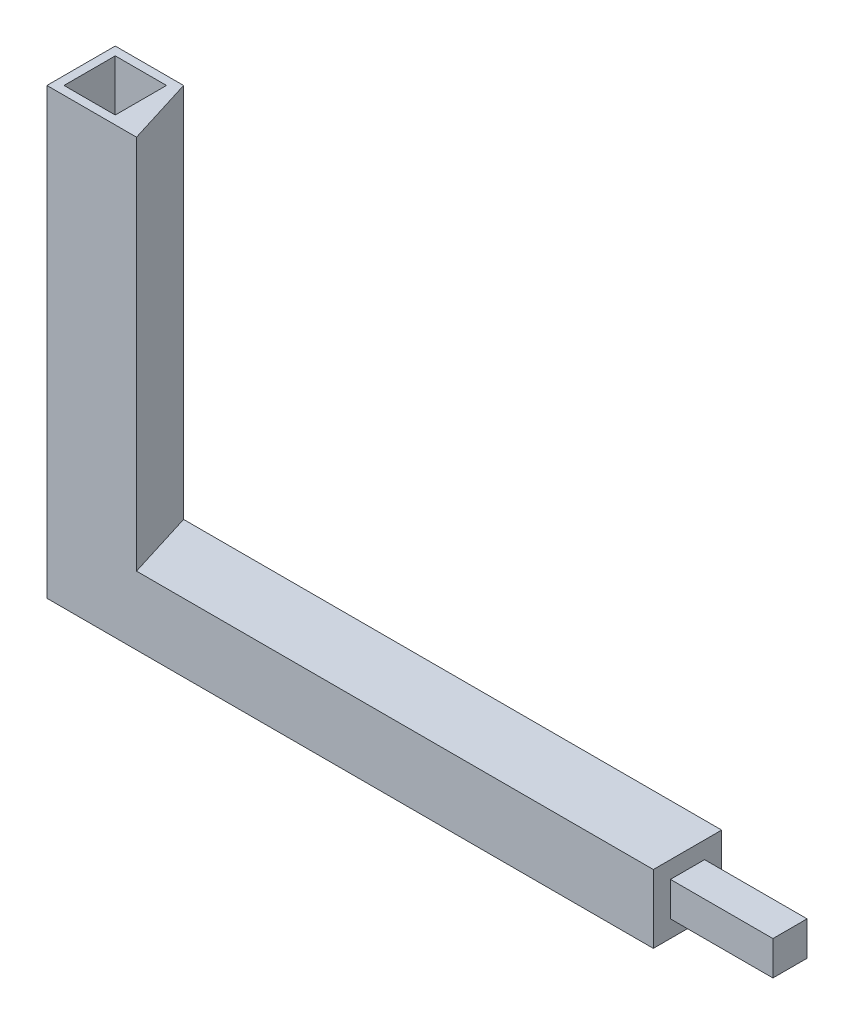
ISO-10303-21;
HEADER;
FILE_DESCRIPTION(('STEP AP214'),'2;1');
FILE_NAME('part.step','',(''),(''),'','','');
FILE_SCHEMA(('AUTOMOTIVE_DESIGN { 1 0 10303 214 1 1 1 1 }'));
ENDSEC;
DATA;
#1=APPLICATION_CONTEXT('core data for automotive mechanical design processes');
#2=APPLICATION_PROTOCOL_DEFINITION('international standard','automotive_design',2000,#1);
#3=PRODUCT_CONTEXT('',#1,'mechanical');
#4=PRODUCT('Part','Part','',(#3));
#5=PRODUCT_RELATED_PRODUCT_CATEGORY('part','',(#4));
#6=PRODUCT_DEFINITION_FORMATION('','',#4);
#7=PRODUCT_DEFINITION_CONTEXT('part definition',#1,'design');
#8=PRODUCT_DEFINITION('design','',#6,#7);
#9=PRODUCT_DEFINITION_SHAPE('','',#8);
#10=(LENGTH_UNIT() NAMED_UNIT(*) SI_UNIT(.MILLI.,.METRE.));
#11=(NAMED_UNIT(*) PLANE_ANGLE_UNIT() SI_UNIT($,.RADIAN.));
#12=(NAMED_UNIT(*) SI_UNIT($,.STERADIAN.) SOLID_ANGLE_UNIT());
#13=UNCERTAINTY_MEASURE_WITH_UNIT(LENGTH_MEASURE(1.E-05),#10,'distance_accuracy_value','');
#14=(GEOMETRIC_REPRESENTATION_CONTEXT(3) GLOBAL_UNCERTAINTY_ASSIGNED_CONTEXT((#13)) GLOBAL_UNIT_ASSIGNED_CONTEXT((#10,
#11,#12)) REPRESENTATION_CONTEXT('',''));
#15=CARTESIAN_POINT('',(0.,0.,0.));
#16=DIRECTION('',(0.,0.,1.));
#17=DIRECTION('',(1.,0.,0.));
#18=AXIS2_PLACEMENT_3D('',#15,#16,#17);
#19=CARTESIAN_POINT('',(177.5,20.,-20.));
#20=DIRECTION('',(-1.,0.,0.));
#21=DIRECTION('',(0.,0.,1.));
#22=AXIS2_PLACEMENT_3D('',#19,#20,#21);
#23=PLANE('',#22);
#24=DIRECTION('',(0.,0.,-1.));
#25=VECTOR('',#24,1.);
#26=CARTESIAN_POINT('',(177.5,0.,-20.));
#27=LINE('',#26,#25);
#28=CARTESIAN_POINT('',(177.5,0.,0.));
#29=VERTEX_POINT('',#28);
#30=CARTESIAN_POINT('',(177.5,0.,-20.));
#31=VERTEX_POINT('',#30);
#32=EDGE_CURVE('E236',#29,#31,#27,.T.);
#33=ORIENTED_EDGE('',*,*,#32,.T.);
#34=DIRECTION('',(0.,-1.,0.));
#35=VECTOR('',#34,1.);
#36=CARTESIAN_POINT('',(177.5,20.,-20.));
#37=LINE('',#36,#35);
#38=CARTESIAN_POINT('',(177.5,20.,-20.));
#39=VERTEX_POINT('',#38);
#40=EDGE_CURVE('E42',#39,#31,#37,.T.);
#41=ORIENTED_EDGE('',*,*,#40,.F.);
#42=DIRECTION('',(0.,0.,-1.));
#43=VECTOR('',#42,1.);
#44=CARTESIAN_POINT('',(177.5,20.,-20.));
#45=LINE('',#44,#43);
#46=CARTESIAN_POINT('',(177.5,20.,0.));
#47=VERTEX_POINT('',#46);
#48=EDGE_CURVE('E228',#47,#39,#45,.T.);
#49=ORIENTED_EDGE('',*,*,#48,.F.);
#50=DIRECTION('',(0.,-1.,0.));
#51=VECTOR('',#50,1.);
#52=CARTESIAN_POINT('',(177.5,20.,0.));
#53=LINE('',#52,#51);
#54=EDGE_CURVE('E11',#47,#29,#53,.T.);
#55=ORIENTED_EDGE('',*,*,#54,.T.);
#56=EDGE_LOOP('',(#33,#41,#49,#55));
#57=FACE_BOUND('',#56,.T.);
#58=DIRECTION('',(0.,1.,0.));
#59=VECTOR('',#58,1.);
#60=CARTESIAN_POINT('',(177.5,15.,-15.));
#61=LINE('',#60,#59);
#62=CARTESIAN_POINT('',(177.5,5.,-15.));
#63=VERTEX_POINT('',#62);
#64=CARTESIAN_POINT('',(177.5,15.,-15.));
#65=VERTEX_POINT('',#64);
#66=EDGE_CURVE('E57',#63,#65,#61,.T.);
#67=ORIENTED_EDGE('',*,*,#66,.F.);
#68=DIRECTION('',(0.,0.,-1.));
#69=VECTOR('',#68,1.);
#70=CARTESIAN_POINT('',(177.5,5.,-5.));
#71=LINE('',#70,#69);
#72=CARTESIAN_POINT('',(177.5,5.,-5.));
#73=VERTEX_POINT('',#72);
#74=EDGE_CURVE('E180',#73,#63,#71,.T.);
#75=ORIENTED_EDGE('',*,*,#74,.F.);
#76=DIRECTION('',(0.,-1.,0.));
#77=VECTOR('',#76,1.);
#78=CARTESIAN_POINT('',(177.5,15.,-5.));
#79=LINE('',#78,#77);
#80=CARTESIAN_POINT('',(177.5,15.,-5.));
#81=VERTEX_POINT('',#80);
#82=EDGE_CURVE('E191',#81,#73,#79,.T.);
#83=ORIENTED_EDGE('',*,*,#82,.F.);
#84=DIRECTION('',(0.,0.,1.));
#85=VECTOR('',#84,1.);
#86=CARTESIAN_POINT('',(177.5,15.,-5.));
#87=LINE('',#86,#85);
#88=EDGE_CURVE('E188',#65,#81,#87,.T.);
#89=ORIENTED_EDGE('',*,*,#88,.F.);
#90=EDGE_LOOP('',(#67,#75,#83,#89));
#91=FACE_BOUND('',#90,.T.);
#92=ADVANCED_FACE('F33',(#57,#91),#23,.F.);
#93=CARTESIAN_POINT('',(0.,20.,0.));
#94=DIRECTION('',(0.,-1.,0.));
#95=DIRECTION('',(0.,0.,-1.));
#96=AXIS2_PLACEMENT_3D('',#93,#94,#95);
#97=PLANE('',#96);
#98=DIRECTION('',(-0.297374874077783,0.,-0.954760799502798));
#99=VECTOR('',#98,1.);
#100=CARTESIAN_POINT('',(20.,20.,-20.));
#101=LINE('',#100,#99);
#102=CARTESIAN_POINT('',(26.2293063190831,20.,0.));
#103=VERTEX_POINT('',#102);
#104=CARTESIAN_POINT('',(20.,20.,-20.));
#105=VERTEX_POINT('',#104);
#106=EDGE_CURVE('E206',#103,#105,#101,.T.);
#107=ORIENTED_EDGE('',*,*,#106,.F.);
#108=DIRECTION('',(1.,0.,0.));
#109=VECTOR('',#108,1.);
#110=CARTESIAN_POINT('',(177.5,20.,0.));
#111=LINE('',#110,#109);
#112=EDGE_CURVE('E226',#103,#47,#111,.T.);
#113=ORIENTED_EDGE('',*,*,#112,.T.);
#114=ORIENTED_EDGE('',*,*,#48,.T.);
#115=DIRECTION('',(-1.,0.,0.));
#116=VECTOR('',#115,1.);
#117=CARTESIAN_POINT('',(0.,20.,-20.));
#118=LINE('',#117,#116);
#119=EDGE_CURVE('E231',#39,#105,#118,.T.);
#120=ORIENTED_EDGE('',*,*,#119,.T.);
#121=EDGE_LOOP('',(#107,#113,#114,#120));
#122=FACE_BOUND('',#121,.T.);
#123=ADVANCED_FACE('F274',(#122),#97,.F.);
#124=CARTESIAN_POINT('',(177.5,20.,0.));
#125=DIRECTION('',(0.,0.,-1.));
#126=DIRECTION('',(-1.,0.,0.));
#127=AXIS2_PLACEMENT_3D('',#124,#125,#126);
#128=PLANE('',#127);
#129=DIRECTION('',(1.,0.,0.));
#130=VECTOR('',#129,1.);
#131=CARTESIAN_POINT('',(177.5,0.,0.));
#132=LINE('',#131,#130);
#133=CARTESIAN_POINT('',(0.,0.,0.));
#134=VERTEX_POINT('',#133);
#135=EDGE_CURVE('E225',#134,#29,#132,.T.);
#136=ORIENTED_EDGE('',*,*,#135,.T.);
#137=ORIENTED_EDGE('',*,*,#54,.F.);
#138=ORIENTED_EDGE('',*,*,#112,.F.);
#139=DIRECTION('',(0.,-1.,0.));
#140=VECTOR('',#139,1.);
#141=CARTESIAN_POINT('',(26.2293063190831,130.,0.));
#142=LINE('',#141,#140);
#143=CARTESIAN_POINT('',(26.2293063190831,130.,0.));
#144=VERTEX_POINT('',#143);
#145=EDGE_CURVE('E222',#144,#103,#142,.T.);
#146=ORIENTED_EDGE('',*,*,#145,.F.);
#147=DIRECTION('',(1.,0.,0.));
#148=VECTOR('',#147,1.);
#149=CARTESIAN_POINT('',(26.2293063190831,130.,0.));
#150=LINE('',#149,#148);
#151=CARTESIAN_POINT('',(0.,130.,0.));
#152=VERTEX_POINT('',#151);
#153=EDGE_CURVE('E210',#152,#144,#150,.T.);
#154=ORIENTED_EDGE('',*,*,#153,.F.);
#155=DIRECTION('',(0.,-1.,0.));
#156=VECTOR('',#155,1.);
#157=CARTESIAN_POINT('',(0.,20.,0.));
#158=LINE('',#157,#156);
#159=EDGE_CURVE('E233',#152,#134,#158,.T.);
#160=ORIENTED_EDGE('',*,*,#159,.T.);
#161=EDGE_LOOP('',(#136,#137,#138,#146,#154,#160));
#162=FACE_BOUND('',#161,.T.);
#163=ADVANCED_FACE('F35',(#162),#128,.F.);
#164=CARTESIAN_POINT('',(0.,20.,-20.));
#165=DIRECTION('',(0.,0.,1.));
#166=DIRECTION('',(1.,0.,0.));
#167=AXIS2_PLACEMENT_3D('',#164,#165,#166);
#168=PLANE('',#167);
#169=CARTESIAN_POINT('',(10.,80.,-20.));
#170=DIRECTION('',(0.,0.,-1.));
#171=DIRECTION('',(-1.,0.,0.));
#172=AXIS2_PLACEMENT_3D('',#169,#170,#171);
#173=CIRCLE('',#172,1.6);
#174=CARTESIAN_POINT('',(8.4,80.,-20.));
#175=VERTEX_POINT('',#174);
#176=EDGE_CURVE('E173',#175,#175,#173,.T.);
#177=ORIENTED_EDGE('',*,*,#176,.F.);
#178=EDGE_LOOP('',(#177));
#179=FACE_BOUND('',#178,.T.);
#180=DIRECTION('',(-1.,0.,0.));
#181=VECTOR('',#180,1.);
#182=CARTESIAN_POINT('',(0.,0.,-20.));
#183=LINE('',#182,#181);
#184=CARTESIAN_POINT('',(0.,0.,-20.));
#185=VERTEX_POINT('',#184);
#186=EDGE_CURVE('E238',#31,#185,#183,.T.);
#187=ORIENTED_EDGE('',*,*,#186,.T.);
#188=DIRECTION('',(0.,-1.,0.));
#189=VECTOR('',#188,1.);
#190=CARTESIAN_POINT('',(0.,20.,-20.));
#191=LINE('',#190,#189);
#192=CARTESIAN_POINT('',(0.,130.,-20.));
#193=VERTEX_POINT('',#192);
#194=EDGE_CURVE('E243',#193,#185,#191,.T.);
#195=ORIENTED_EDGE('',*,*,#194,.F.);
#196=DIRECTION('',(-1.,0.,0.));
#197=VECTOR('',#196,1.);
#198=CARTESIAN_POINT('',(0.,130.,-20.));
#199=LINE('',#198,#197);
#200=CARTESIAN_POINT('',(20.,130.,-20.));
#201=VERTEX_POINT('',#200);
#202=EDGE_CURVE('E214',#201,#193,#199,.T.);
#203=ORIENTED_EDGE('',*,*,#202,.F.);
#204=DIRECTION('',(0.,-1.,0.));
#205=VECTOR('',#204,1.);
#206=CARTESIAN_POINT('',(20.,130.,-20.));
#207=LINE('',#206,#205);
#208=EDGE_CURVE('E217',#201,#105,#207,.T.);
#209=ORIENTED_EDGE('',*,*,#208,.T.);
#210=ORIENTED_EDGE('',*,*,#119,.F.);
#211=ORIENTED_EDGE('',*,*,#40,.T.);
#212=EDGE_LOOP('',(#187,#195,#203,#209,#210,#211));
#213=FACE_BOUND('',#212,.T.);
#214=ADVANCED_FACE('F251',(#179,#213),#168,.F.);
#215=CARTESIAN_POINT('',(0.,20.,0.));
#216=DIRECTION('',(1.,0.,0.));
#217=DIRECTION('',(0.,0.,-1.));
#218=AXIS2_PLACEMENT_3D('',#215,#216,#217);
#219=PLANE('',#218);
#220=DIRECTION('',(0.,0.,1.));
#221=VECTOR('',#220,1.);
#222=CARTESIAN_POINT('',(0.,0.,0.));
#223=LINE('',#222,#221);
#224=EDGE_CURVE('E229',#185,#134,#223,.T.);
#225=ORIENTED_EDGE('',*,*,#224,.T.);
#226=ORIENTED_EDGE('',*,*,#159,.F.);
#227=DIRECTION('',(0.,0.,1.));
#228=VECTOR('',#227,1.);
#229=CARTESIAN_POINT('',(0.,130.,0.));
#230=LINE('',#229,#228);
#231=EDGE_CURVE('E207',#193,#152,#230,.T.);
#232=ORIENTED_EDGE('',*,*,#231,.F.);
#233=ORIENTED_EDGE('',*,*,#194,.T.);
#234=EDGE_LOOP('',(#225,#226,#232,#233));
#235=FACE_BOUND('',#234,.T.);
#236=ADVANCED_FACE('F259',(#235),#219,.F.);
#237=CARTESIAN_POINT('',(0.,0.,0.));
#238=DIRECTION('',(0.,-1.,0.));
#239=DIRECTION('',(0.,0.,-1.));
#240=AXIS2_PLACEMENT_3D('',#237,#238,#239);
#241=PLANE('',#240);
#242=ORIENTED_EDGE('',*,*,#135,.F.);
#243=ORIENTED_EDGE('',*,*,#224,.F.);
#244=ORIENTED_EDGE('',*,*,#186,.F.);
#245=ORIENTED_EDGE('',*,*,#32,.F.);
#246=EDGE_LOOP('',(#242,#243,#244,#245));
#247=FACE_BOUND('',#246,.T.);
#248=ADVANCED_FACE('F257',(#247),#241,.T.);
#249=CARTESIAN_POINT('',(20.,130.,-20.));
#250=DIRECTION('',(-0.954760799502798,0.,0.297374874077783));
#251=DIRECTION('',(0.297374874077783,0.,0.954760799502798));
#252=AXIS2_PLACEMENT_3D('',#249,#250,#251);
#253=PLANE('',#252);
#254=ORIENTED_EDGE('',*,*,#106,.T.);
#255=ORIENTED_EDGE('',*,*,#208,.F.);
#256=DIRECTION('',(-0.297374874077783,0.,-0.954760799502798));
#257=VECTOR('',#256,1.);
#258=CARTESIAN_POINT('',(20.,130.,-20.));
#259=LINE('',#258,#257);
#260=EDGE_CURVE('E212',#144,#201,#259,.T.);
#261=ORIENTED_EDGE('',*,*,#260,.F.);
#262=ORIENTED_EDGE('',*,*,#145,.T.);
#263=EDGE_LOOP('',(#254,#255,#261,#262));
#264=FACE_BOUND('',#263,.T.);
#265=ADVANCED_FACE('F272',(#264),#253,.F.);
#266=CARTESIAN_POINT('',(0.,130.,0.));
#267=DIRECTION('',(0.,-1.,0.));
#268=DIRECTION('',(0.,0.,-1.));
#269=AXIS2_PLACEMENT_3D('',#266,#267,#268);
#270=PLANE('',#269);
#271=DIRECTION('',(1.,0.,0.));
#272=VECTOR('',#271,1.);
#273=CARTESIAN_POINT('',(17.5,130.,-2.50000000000001));
#274=LINE('',#273,#272);
#275=CARTESIAN_POINT('',(2.5,130.,-2.5));
#276=VERTEX_POINT('',#275);
#277=CARTESIAN_POINT('',(17.5,130.,-2.50000000000001));
#278=VERTEX_POINT('',#277);
#279=EDGE_CURVE('E164',#276,#278,#274,.T.);
#280=ORIENTED_EDGE('',*,*,#279,.F.);
#281=DIRECTION('',(0.,0.,1.));
#282=VECTOR('',#281,1.);
#283=CARTESIAN_POINT('',(2.5,130.,-2.5));
#284=LINE('',#283,#282);
#285=CARTESIAN_POINT('',(2.5,130.,-17.5));
#286=VERTEX_POINT('',#285);
#287=EDGE_CURVE('E49',#286,#276,#284,.T.);
#288=ORIENTED_EDGE('',*,*,#287,.F.);
#289=DIRECTION('',(-1.,0.,0.));
#290=VECTOR('',#289,1.);
#291=CARTESIAN_POINT('',(17.5,130.,-17.5));
#292=LINE('',#291,#290);
#293=CARTESIAN_POINT('',(17.5,130.,-17.5));
#294=VERTEX_POINT('',#293);
#295=EDGE_CURVE('E155',#294,#286,#292,.T.);
#296=ORIENTED_EDGE('',*,*,#295,.F.);
#297=DIRECTION('',(0.,0.,-1.));
#298=VECTOR('',#297,1.);
#299=CARTESIAN_POINT('',(17.5,130.,-2.50000000000001));
#300=LINE('',#299,#298);
#301=EDGE_CURVE('E158',#278,#294,#300,.T.);
#302=ORIENTED_EDGE('',*,*,#301,.F.);
#303=EDGE_LOOP('',(#280,#288,#296,#302));
#304=FACE_BOUND('',#303,.T.);
#305=ORIENTED_EDGE('',*,*,#231,.T.);
#306=ORIENTED_EDGE('',*,*,#153,.T.);
#307=ORIENTED_EDGE('',*,*,#260,.T.);
#308=ORIENTED_EDGE('',*,*,#202,.T.);
#309=EDGE_LOOP('',(#305,#306,#307,#308));
#310=FACE_BOUND('',#309,.T.);
#311=ADVANCED_FACE('F268',(#304,#310),#270,.F.);
#312=CARTESIAN_POINT('',(207.5,15.,-15.));
#313=DIRECTION('',(0.,0.,1.));
#314=DIRECTION('',(1.,0.,0.));
#315=AXIS2_PLACEMENT_3D('',#312,#313,#314);
#316=PLANE('',#315);
#317=ORIENTED_EDGE('',*,*,#66,.T.);
#318=DIRECTION('',(-1.,0.,0.));
#319=VECTOR('',#318,1.);
#320=CARTESIAN_POINT('',(207.5,15.,-15.));
#321=LINE('',#320,#319);
#322=CARTESIAN_POINT('',(207.5,15.,-15.));
#323=VERTEX_POINT('',#322);
#324=EDGE_CURVE('E203',#323,#65,#321,.T.);
#325=ORIENTED_EDGE('',*,*,#324,.F.);
#326=DIRECTION('',(0.,1.,0.));
#327=VECTOR('',#326,1.);
#328=CARTESIAN_POINT('',(207.5,15.,-15.));
#329=LINE('',#328,#327);
#330=CARTESIAN_POINT('',(207.5,5.,-15.));
#331=VERTEX_POINT('',#330);
#332=EDGE_CURVE('E176',#331,#323,#329,.T.);
#333=ORIENTED_EDGE('',*,*,#332,.F.);
#334=DIRECTION('',(-1.,0.,0.));
#335=VECTOR('',#334,1.);
#336=CARTESIAN_POINT('',(207.5,5.,-15.));
#337=LINE('',#336,#335);
#338=EDGE_CURVE('E186',#331,#63,#337,.T.);
#339=ORIENTED_EDGE('',*,*,#338,.T.);
#340=EDGE_LOOP('',(#317,#325,#333,#339));
#341=FACE_BOUND('',#340,.T.);
#342=ADVANCED_FACE('F292',(#341),#316,.F.);
#343=CARTESIAN_POINT('',(207.5,15.,-5.));
#344=DIRECTION('',(0.,-1.,0.));
#345=DIRECTION('',(0.,0.,-1.));
#346=AXIS2_PLACEMENT_3D('',#343,#344,#345);
#347=PLANE('',#346);
#348=ORIENTED_EDGE('',*,*,#88,.T.);
#349=DIRECTION('',(-1.,0.,0.));
#350=VECTOR('',#349,1.);
#351=CARTESIAN_POINT('',(207.5,15.,-5.));
#352=LINE('',#351,#350);
#353=CARTESIAN_POINT('',(207.5,15.,-5.));
#354=VERTEX_POINT('',#353);
#355=EDGE_CURVE('E200',#354,#81,#352,.T.);
#356=ORIENTED_EDGE('',*,*,#355,.F.);
#357=DIRECTION('',(0.,0.,1.));
#358=VECTOR('',#357,1.);
#359=CARTESIAN_POINT('',(207.5,15.,-5.));
#360=LINE('',#359,#358);
#361=EDGE_CURVE('E179',#323,#354,#360,.T.);
#362=ORIENTED_EDGE('',*,*,#361,.F.);
#363=ORIENTED_EDGE('',*,*,#324,.T.);
#364=EDGE_LOOP('',(#348,#356,#362,#363));
#365=FACE_BOUND('',#364,.T.);
#366=ADVANCED_FACE('F296',(#365),#347,.F.);
#367=CARTESIAN_POINT('',(207.5,15.,-5.));
#368=DIRECTION('',(0.,0.,-1.));
#369=DIRECTION('',(0.,1.,0.));
#370=AXIS2_PLACEMENT_3D('',#367,#368,#369);
#371=PLANE('',#370);
#372=ORIENTED_EDGE('',*,*,#82,.T.);
#373=DIRECTION('',(-1.,0.,0.));
#374=VECTOR('',#373,1.);
#375=CARTESIAN_POINT('',(207.5,5.,-5.));
#376=LINE('',#375,#374);
#377=CARTESIAN_POINT('',(207.5,5.,-5.));
#378=VERTEX_POINT('',#377);
#379=EDGE_CURVE('E197',#378,#73,#376,.T.);
#380=ORIENTED_EDGE('',*,*,#379,.F.);
#381=DIRECTION('',(0.,-1.,0.));
#382=VECTOR('',#381,1.);
#383=CARTESIAN_POINT('',(207.5,15.,-5.));
#384=LINE('',#383,#382);
#385=EDGE_CURVE('E182',#354,#378,#384,.T.);
#386=ORIENTED_EDGE('',*,*,#385,.F.);
#387=ORIENTED_EDGE('',*,*,#355,.T.);
#388=EDGE_LOOP('',(#372,#380,#386,#387));
#389=FACE_BOUND('',#388,.T.);
#390=ADVANCED_FACE('F300',(#389),#371,.F.);
#391=CARTESIAN_POINT('',(207.5,5.,-5.));
#392=DIRECTION('',(0.,1.,0.));
#393=DIRECTION('',(0.,0.,1.));
#394=AXIS2_PLACEMENT_3D('',#391,#392,#393);
#395=PLANE('',#394);
#396=ORIENTED_EDGE('',*,*,#74,.T.);
#397=ORIENTED_EDGE('',*,*,#338,.F.);
#398=DIRECTION('',(0.,0.,-1.));
#399=VECTOR('',#398,1.);
#400=CARTESIAN_POINT('',(207.5,5.,-5.));
#401=LINE('',#400,#399);
#402=EDGE_CURVE('E184',#378,#331,#401,.T.);
#403=ORIENTED_EDGE('',*,*,#402,.F.);
#404=ORIENTED_EDGE('',*,*,#379,.T.);
#405=EDGE_LOOP('',(#396,#397,#403,#404));
#406=FACE_BOUND('',#405,.T.);
#407=ADVANCED_FACE('F304',(#406),#395,.F.);
#408=CARTESIAN_POINT('',(207.5,0.,0.));
#409=DIRECTION('',(1.,0.,0.));
#410=DIRECTION('',(0.,0.,-1.));
#411=AXIS2_PLACEMENT_3D('',#408,#409,#410);
#412=PLANE('',#411);
#413=ORIENTED_EDGE('',*,*,#332,.T.);
#414=ORIENTED_EDGE('',*,*,#361,.T.);
#415=ORIENTED_EDGE('',*,*,#385,.T.);
#416=ORIENTED_EDGE('',*,*,#402,.T.);
#417=EDGE_LOOP('',(#413,#414,#415,#416));
#418=FACE_BOUND('',#417,.T.);
#419=ADVANCED_FACE('F308',(#418),#412,.T.);
#420=CARTESIAN_POINT('',(10.,80.,-20.));
#421=DIRECTION('',(0.,0.,-1.));
#422=DIRECTION('',(-1.,0.,0.));
#423=AXIS2_PLACEMENT_3D('',#420,#421,#422);
#424=CYLINDRICAL_SURFACE('',#423,1.6);
#425=CARTESIAN_POINT('',(10.,80.,-17.5));
#426=DIRECTION('',(0.,0.,-1.));
#427=DIRECTION('',(-1.,0.,0.));
#428=AXIS2_PLACEMENT_3D('',#425,#426,#427);
#429=CIRCLE('',#428,1.6);
#430=CARTESIAN_POINT('',(8.4,80.,-17.5));
#431=VERTEX_POINT('',#430);
#432=EDGE_CURVE('E37',#431,#431,#429,.F.);
#433=ORIENTED_EDGE('',*,*,#432,.T.);
#434=EDGE_LOOP('',(#433));
#435=FACE_BOUND('',#434,.T.);
#436=ORIENTED_EDGE('',*,*,#176,.T.);
#437=EDGE_LOOP('',(#436));
#438=FACE_BOUND('',#437,.T.);
#439=ADVANCED_FACE('F312',(#435,#438),#424,.F.);
#440=CARTESIAN_POINT('',(17.5,70.,-17.5));
#441=DIRECTION('',(0.,0.,-1.));
#442=DIRECTION('',(-1.,0.,0.));
#443=AXIS2_PLACEMENT_3D('',#440,#441,#442);
#444=PLANE('',#443);
#445=ORIENTED_EDGE('',*,*,#295,.T.);
#446=DIRECTION('',(0.,1.,0.));
#447=VECTOR('',#446,1.);
#448=CARTESIAN_POINT('',(2.5,70.,-17.5));
#449=LINE('',#448,#447);
#450=CARTESIAN_POINT('',(2.5,70.,-17.5));
#451=VERTEX_POINT('',#450);
#452=EDGE_CURVE('E168',#451,#286,#449,.T.);
#453=ORIENTED_EDGE('',*,*,#452,.F.);
#454=DIRECTION('',(-1.,0.,0.));
#455=VECTOR('',#454,1.);
#456=CARTESIAN_POINT('',(17.5,70.,-17.5));
#457=LINE('',#456,#455);
#458=CARTESIAN_POINT('',(17.5,70.,-17.5));
#459=VERTEX_POINT('',#458);
#460=EDGE_CURVE('E143',#459,#451,#457,.T.);
#461=ORIENTED_EDGE('',*,*,#460,.F.);
#462=DIRECTION('',(0.,1.,0.));
#463=VECTOR('',#462,1.);
#464=CARTESIAN_POINT('',(17.5,70.,-17.5));
#465=LINE('',#464,#463);
#466=EDGE_CURVE('E170',#459,#294,#465,.T.);
#467=ORIENTED_EDGE('',*,*,#466,.T.);
#468=EDGE_LOOP('',(#445,#453,#461,#467));
#469=FACE_BOUND('',#468,.T.);
#470=ORIENTED_EDGE('',*,*,#432,.F.);
#471=EDGE_LOOP('',(#470));
#472=FACE_BOUND('',#471,.T.);
#473=ADVANCED_FACE('F316',(#469,#472),#444,.F.);
#474=CARTESIAN_POINT('',(2.5,70.,-2.5));
#475=DIRECTION('',(-1.,0.,0.));
#476=DIRECTION('',(0.,0.,1.));
#477=AXIS2_PLACEMENT_3D('',#474,#475,#476);
#478=PLANE('',#477);
#479=ORIENTED_EDGE('',*,*,#287,.T.);
#480=DIRECTION('',(0.,1.,0.));
#481=VECTOR('',#480,1.);
#482=CARTESIAN_POINT('',(2.5,70.,-2.5));
#483=LINE('',#482,#481);
#484=CARTESIAN_POINT('',(2.5,70.,-2.5));
#485=VERTEX_POINT('',#484);
#486=EDGE_CURVE('E133',#485,#276,#483,.T.);
#487=ORIENTED_EDGE('',*,*,#486,.F.);
#488=DIRECTION('',(0.,0.,1.));
#489=VECTOR('',#488,1.);
#490=CARTESIAN_POINT('',(2.5,70.,-2.5));
#491=LINE('',#490,#489);
#492=EDGE_CURVE('E137',#451,#485,#491,.T.);
#493=ORIENTED_EDGE('',*,*,#492,.F.);
#494=ORIENTED_EDGE('',*,*,#452,.T.);
#495=EDGE_LOOP('',(#479,#487,#493,#494));
#496=FACE_BOUND('',#495,.T.);
#497=ADVANCED_FACE('F135',(#496),#478,.F.);
#498=CARTESIAN_POINT('',(17.5,70.,-2.50000000000001));
#499=DIRECTION('',(1.,0.,0.));
#500=DIRECTION('',(0.,0.,-1.));
#501=AXIS2_PLACEMENT_3D('',#498,#499,#500);
#502=PLANE('',#501);
#503=ORIENTED_EDGE('',*,*,#301,.T.);
#504=ORIENTED_EDGE('',*,*,#466,.F.);
#505=DIRECTION('',(0.,0.,-1.));
#506=VECTOR('',#505,1.);
#507=CARTESIAN_POINT('',(17.5,70.,-2.50000000000001));
#508=LINE('',#507,#506);
#509=CARTESIAN_POINT('',(17.5,70.,-2.50000000000001));
#510=VERTEX_POINT('',#509);
#511=EDGE_CURVE('E151',#510,#459,#508,.T.);
#512=ORIENTED_EDGE('',*,*,#511,.F.);
#513=DIRECTION('',(0.,1.,0.));
#514=VECTOR('',#513,1.);
#515=CARTESIAN_POINT('',(17.5,70.,-2.50000000000001));
#516=LINE('',#515,#514);
#517=EDGE_CURVE('E142',#510,#278,#516,.T.);
#518=ORIENTED_EDGE('',*,*,#517,.T.);
#519=EDGE_LOOP('',(#503,#504,#512,#518));
#520=FACE_BOUND('',#519,.T.);
#521=ADVANCED_FACE('F320',(#520),#502,.F.);
#522=CARTESIAN_POINT('',(17.5,70.,-2.50000000000001));
#523=DIRECTION('',(0.,0.,1.));
#524=DIRECTION('',(1.,0.,0.));
#525=AXIS2_PLACEMENT_3D('',#522,#523,#524);
#526=PLANE('',#525);
#527=ORIENTED_EDGE('',*,*,#279,.T.);
#528=ORIENTED_EDGE('',*,*,#517,.F.);
#529=DIRECTION('',(1.,0.,0.));
#530=VECTOR('',#529,1.);
#531=CARTESIAN_POINT('',(17.5,70.,-2.50000000000001));
#532=LINE('',#531,#530);
#533=EDGE_CURVE('E146',#485,#510,#532,.T.);
#534=ORIENTED_EDGE('',*,*,#533,.F.);
#535=ORIENTED_EDGE('',*,*,#486,.T.);
#536=EDGE_LOOP('',(#527,#528,#534,#535));
#537=FACE_BOUND('',#536,.T.);
#538=ADVANCED_FACE('F147',(#537),#526,.F.);
#539=CARTESIAN_POINT('',(0.,70.,0.));
#540=DIRECTION('',(0.,1.,0.));
#541=DIRECTION('',(0.,0.,1.));
#542=AXIS2_PLACEMENT_3D('',#539,#540,#541);
#543=PLANE('',#542);
#544=ORIENTED_EDGE('',*,*,#492,.T.);
#545=ORIENTED_EDGE('',*,*,#533,.T.);
#546=ORIENTED_EDGE('',*,*,#511,.T.);
#547=ORIENTED_EDGE('',*,*,#460,.T.);
#548=EDGE_LOOP('',(#544,#545,#546,#547));
#549=FACE_BOUND('',#548,.T.);
#550=ADVANCED_FACE('F153',(#549),#543,.T.);
#551=CLOSED_SHELL('',(#92,#123,#163,#214,#236,#248,#265,#311,#342,#366,#390,#407,#419,#439,#473,
#497,#521,#538,#550));
#552=MANIFOLD_SOLID_BREP('B2',#551);
#553=ADVANCED_BREP_SHAPE_REPRESENTATION('',(#18,#552),#14);
#554=SHAPE_DEFINITION_REPRESENTATION(#9,#553);
ENDSEC;
END-ISO-10303-21;
